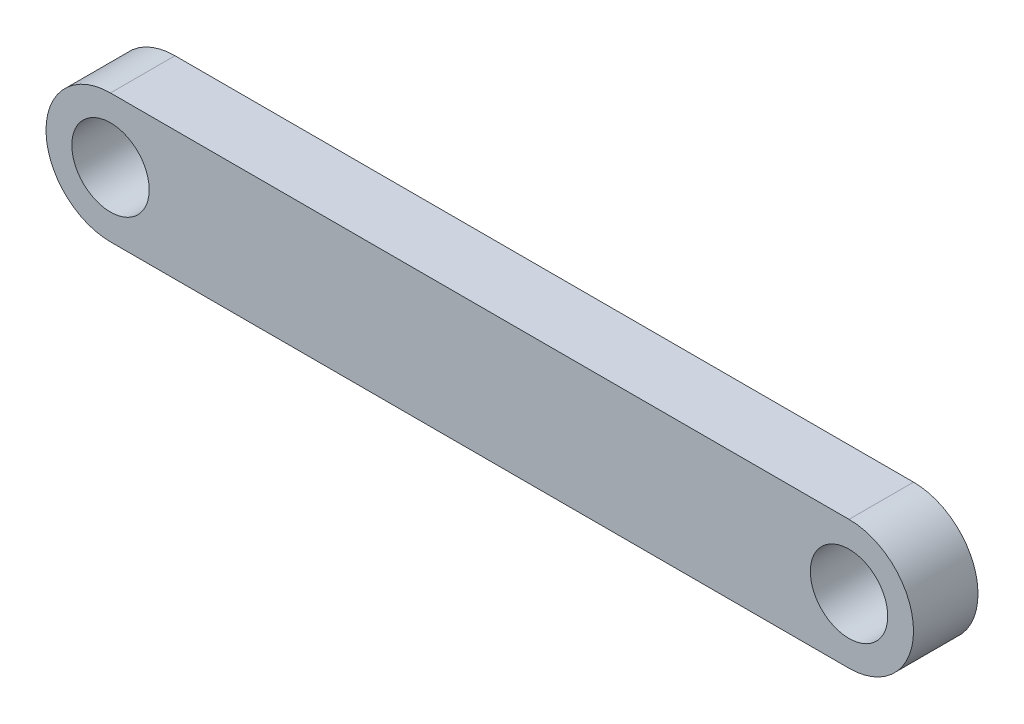
ISO-10303-21;
HEADER;
FILE_DESCRIPTION(('STEP AP214'),'2;1');
FILE_NAME('part.step','',(''),(''),'','','');
FILE_SCHEMA(('AUTOMOTIVE_DESIGN { 1 0 10303 214 1 1 1 1 }'));
ENDSEC;
DATA;
#1=APPLICATION_CONTEXT('core data for automotive mechanical design processes');
#2=APPLICATION_PROTOCOL_DEFINITION('international standard','automotive_design',2000,#1);
#3=PRODUCT_CONTEXT('',#1,'mechanical');
#4=PRODUCT('Part','Part','',(#3));
#5=PRODUCT_RELATED_PRODUCT_CATEGORY('part','',(#4));
#6=PRODUCT_DEFINITION_FORMATION('','',#4);
#7=PRODUCT_DEFINITION_CONTEXT('part definition',#1,'design');
#8=PRODUCT_DEFINITION('design','',#6,#7);
#9=PRODUCT_DEFINITION_SHAPE('','',#8);
#10=(LENGTH_UNIT() NAMED_UNIT(*) SI_UNIT(.MILLI.,.METRE.));
#11=(NAMED_UNIT(*) PLANE_ANGLE_UNIT() SI_UNIT($,.RADIAN.));
#12=(NAMED_UNIT(*) SI_UNIT($,.STERADIAN.) SOLID_ANGLE_UNIT());
#13=UNCERTAINTY_MEASURE_WITH_UNIT(LENGTH_MEASURE(1.E-05),#10,'distance_accuracy_value','');
#14=(GEOMETRIC_REPRESENTATION_CONTEXT(3) GLOBAL_UNCERTAINTY_ASSIGNED_CONTEXT((#13)) GLOBAL_UNIT_ASSIGNED_CONTEXT((#10,
#11,#12)) REPRESENTATION_CONTEXT('',''));
#15=CARTESIAN_POINT('',(0.,0.,0.));
#16=DIRECTION('',(0.,0.,1.));
#17=DIRECTION('',(1.,0.,0.));
#18=AXIS2_PLACEMENT_3D('',#15,#16,#17);
#19=CARTESIAN_POINT('',(0.,0.,50.));
#20=DIRECTION('',(0.,0.,1.));
#21=DIRECTION('',(1.,0.,0.));
#22=AXIS2_PLACEMENT_3D('',#19,#20,#21);
#23=PLANE('',#22);
#24=CARTESIAN_POINT('',(0.,0.,50.));
#25=DIRECTION('',(0.,0.,1.));
#26=DIRECTION('',(1.,0.,0.));
#27=AXIS2_PLACEMENT_3D('',#24,#25,#26);
#28=CIRCLE('',#27,30.);
#29=CARTESIAN_POINT('',(30.,0.,50.));
#30=VERTEX_POINT('',#29);
#31=EDGE_CURVE('E118',#30,#30,#28,.T.);
#32=ORIENTED_EDGE('',*,*,#31,.F.);
#33=EDGE_LOOP('',(#32));
#34=FACE_BOUND('',#33,.T.);
#35=CARTESIAN_POINT('',(0.,0.,50.));
#36=DIRECTION('',(0.,0.,1.));
#37=DIRECTION('',(1.,0.,0.));
#38=AXIS2_PLACEMENT_3D('',#35,#36,#37);
#39=CIRCLE('',#38,50.);
#40=CARTESIAN_POINT('',(0.,50.,50.));
#41=VERTEX_POINT('',#40);
#42=CARTESIAN_POINT('',(0.,-50.,50.));
#43=VERTEX_POINT('',#42);
#44=EDGE_CURVE('E98',#41,#43,#39,.T.);
#45=ORIENTED_EDGE('',*,*,#44,.T.);
#46=DIRECTION('',(1.,0.,0.));
#47=VECTOR('',#46,1.);
#48=CARTESIAN_POINT('',(0.,-50.,50.));
#49=LINE('',#48,#47);
#50=CARTESIAN_POINT('',(572.6,-50.,50.));
#51=VERTEX_POINT('',#50);
#52=EDGE_CURVE('E93',#43,#51,#49,.T.);
#53=ORIENTED_EDGE('',*,*,#52,.T.);
#54=CARTESIAN_POINT('',(572.6,0.,50.));
#55=DIRECTION('',(0.,0.,1.));
#56=DIRECTION('',(1.,0.,0.));
#57=AXIS2_PLACEMENT_3D('',#54,#55,#56);
#58=CIRCLE('',#57,50.);
#59=CARTESIAN_POINT('',(572.6,50.,50.));
#60=VERTEX_POINT('',#59);
#61=EDGE_CURVE('E96',#51,#60,#58,.T.);
#62=ORIENTED_EDGE('',*,*,#61,.T.);
#63=DIRECTION('',(-1.,0.,0.));
#64=VECTOR('',#63,1.);
#65=CARTESIAN_POINT('',(0.,50.,50.));
#66=LINE('',#65,#64);
#67=EDGE_CURVE('E63',#60,#41,#66,.T.);
#68=ORIENTED_EDGE('',*,*,#67,.T.);
#69=EDGE_LOOP('',(#45,#53,#62,#68));
#70=FACE_BOUND('',#69,.T.);
#71=CARTESIAN_POINT('',(572.6,0.,50.));
#72=DIRECTION('',(0.,0.,1.));
#73=DIRECTION('',(1.,0.,0.));
#74=AXIS2_PLACEMENT_3D('',#71,#72,#73);
#75=CIRCLE('',#74,30.);
#76=CARTESIAN_POINT('',(602.6,0.,50.));
#77=VERTEX_POINT('',#76);
#78=EDGE_CURVE('E140',#77,#77,#75,.T.);
#79=ORIENTED_EDGE('',*,*,#78,.F.);
#80=EDGE_LOOP('',(#79));
#81=FACE_BOUND('',#80,.T.);
#82=ADVANCED_FACE('F45',(#34,#70,#81),#23,.T.);
#83=CARTESIAN_POINT('',(0.,0.,0.));
#84=DIRECTION('',(0.,0.,1.));
#85=DIRECTION('',(1.,0.,0.));
#86=AXIS2_PLACEMENT_3D('',#83,#84,#85);
#87=PLANE('',#86);
#88=CARTESIAN_POINT('',(0.,0.,0.));
#89=DIRECTION('',(0.,0.,1.));
#90=DIRECTION('',(1.,0.,0.));
#91=AXIS2_PLACEMENT_3D('',#88,#89,#90);
#92=CIRCLE('',#91,50.);
#93=CARTESIAN_POINT('',(0.,50.,0.));
#94=VERTEX_POINT('',#93);
#95=CARTESIAN_POINT('',(0.,-50.,0.));
#96=VERTEX_POINT('',#95);
#97=EDGE_CURVE('E114',#94,#96,#92,.T.);
#98=ORIENTED_EDGE('',*,*,#97,.F.);
#99=DIRECTION('',(-1.,0.,0.));
#100=VECTOR('',#99,1.);
#101=CARTESIAN_POINT('',(0.,50.,0.));
#102=LINE('',#101,#100);
#103=CARTESIAN_POINT('',(572.6,50.,0.));
#104=VERTEX_POINT('',#103);
#105=EDGE_CURVE('E86',#104,#94,#102,.T.);
#106=ORIENTED_EDGE('',*,*,#105,.F.);
#107=CARTESIAN_POINT('',(572.6,0.,0.));
#108=DIRECTION('',(0.,0.,1.));
#109=DIRECTION('',(1.,0.,0.));
#110=AXIS2_PLACEMENT_3D('',#107,#108,#109);
#111=CIRCLE('',#110,50.);
#112=CARTESIAN_POINT('',(572.6,-50.,0.));
#113=VERTEX_POINT('',#112);
#114=EDGE_CURVE('E80',#113,#104,#111,.T.);
#115=ORIENTED_EDGE('',*,*,#114,.F.);
#116=DIRECTION('',(1.,0.,0.));
#117=VECTOR('',#116,1.);
#118=CARTESIAN_POINT('',(0.,-50.,0.));
#119=LINE('',#118,#117);
#120=EDGE_CURVE('E103',#96,#113,#119,.T.);
#121=ORIENTED_EDGE('',*,*,#120,.F.);
#122=EDGE_LOOP('',(#98,#106,#115,#121));
#123=FACE_BOUND('',#122,.T.);
#124=CARTESIAN_POINT('',(0.,0.,0.));
#125=DIRECTION('',(0.,0.,1.));
#126=DIRECTION('',(1.,0.,0.));
#127=AXIS2_PLACEMENT_3D('',#124,#125,#126);
#128=CIRCLE('',#127,30.);
#129=CARTESIAN_POINT('',(30.,0.,0.));
#130=VERTEX_POINT('',#129);
#131=EDGE_CURVE('E136',#130,#130,#128,.T.);
#132=ORIENTED_EDGE('',*,*,#131,.T.);
#133=EDGE_LOOP('',(#132));
#134=FACE_BOUND('',#133,.T.);
#135=CARTESIAN_POINT('',(572.6,0.,0.));
#136=DIRECTION('',(0.,0.,1.));
#137=DIRECTION('',(1.,0.,0.));
#138=AXIS2_PLACEMENT_3D('',#135,#136,#137);
#139=CIRCLE('',#138,30.);
#140=CARTESIAN_POINT('',(602.6,0.,0.));
#141=VERTEX_POINT('',#140);
#142=EDGE_CURVE('E144',#141,#141,#139,.T.);
#143=ORIENTED_EDGE('',*,*,#142,.T.);
#144=EDGE_LOOP('',(#143));
#145=FACE_BOUND('',#144,.T.);
#146=ADVANCED_FACE('F131',(#123,#134,#145),#87,.F.);
#147=CARTESIAN_POINT('',(0.,0.,50.));
#148=DIRECTION('',(0.,0.,-1.));
#149=DIRECTION('',(-1.,0.,0.));
#150=AXIS2_PLACEMENT_3D('',#147,#148,#149);
#151=CYLINDRICAL_SURFACE('',#150,50.);
#152=ORIENTED_EDGE('',*,*,#97,.T.);
#153=DIRECTION('',(0.,0.,-1.));
#154=VECTOR('',#153,1.);
#155=CARTESIAN_POINT('',(0.,-50.,50.));
#156=LINE('',#155,#154);
#157=EDGE_CURVE('E11',#43,#96,#156,.T.);
#158=ORIENTED_EDGE('',*,*,#157,.F.);
#159=ORIENTED_EDGE('',*,*,#44,.F.);
#160=DIRECTION('',(0.,0.,-1.));
#161=VECTOR('',#160,1.);
#162=CARTESIAN_POINT('',(0.,50.,50.));
#163=LINE('',#162,#161);
#164=EDGE_CURVE('E110',#41,#94,#163,.T.);
#165=ORIENTED_EDGE('',*,*,#164,.T.);
#166=EDGE_LOOP('',(#152,#158,#159,#165));
#167=FACE_BOUND('',#166,.T.);
#168=ADVANCED_FACE('F47',(#167),#151,.T.);
#169=CARTESIAN_POINT('',(0.,-50.,50.));
#170=DIRECTION('',(0.,1.,0.));
#171=DIRECTION('',(-1.,0.,0.));
#172=AXIS2_PLACEMENT_3D('',#169,#170,#171);
#173=PLANE('',#172);
#174=ORIENTED_EDGE('',*,*,#120,.T.);
#175=DIRECTION('',(0.,0.,-1.));
#176=VECTOR('',#175,1.);
#177=CARTESIAN_POINT('',(572.6,-50.,50.));
#178=LINE('',#177,#176);
#179=EDGE_CURVE('E55',#51,#113,#178,.T.);
#180=ORIENTED_EDGE('',*,*,#179,.F.);
#181=ORIENTED_EDGE('',*,*,#52,.F.);
#182=ORIENTED_EDGE('',*,*,#157,.T.);
#183=EDGE_LOOP('',(#174,#180,#181,#182));
#184=FACE_BOUND('',#183,.T.);
#185=ADVANCED_FACE('F102',(#184),#173,.F.);
#186=CARTESIAN_POINT('',(572.6,0.,50.));
#187=DIRECTION('',(0.,0.,-1.));
#188=DIRECTION('',(-1.,0.,0.));
#189=AXIS2_PLACEMENT_3D('',#186,#187,#188);
#190=CYLINDRICAL_SURFACE('',#189,50.);
#191=ORIENTED_EDGE('',*,*,#114,.T.);
#192=DIRECTION('',(0.,0.,-1.));
#193=VECTOR('',#192,1.);
#194=CARTESIAN_POINT('',(572.6,50.,50.));
#195=LINE('',#194,#193);
#196=EDGE_CURVE('E105',#60,#104,#195,.T.);
#197=ORIENTED_EDGE('',*,*,#196,.F.);
#198=ORIENTED_EDGE('',*,*,#61,.F.);
#199=ORIENTED_EDGE('',*,*,#179,.T.);
#200=EDGE_LOOP('',(#191,#197,#198,#199));
#201=FACE_BOUND('',#200,.T.);
#202=ADVANCED_FACE('F106',(#201),#190,.T.);
#203=CARTESIAN_POINT('',(0.,50.,50.));
#204=DIRECTION('',(0.,-1.,0.));
#205=DIRECTION('',(1.,0.,0.));
#206=AXIS2_PLACEMENT_3D('',#203,#204,#205);
#207=PLANE('',#206);
#208=ORIENTED_EDGE('',*,*,#105,.T.);
#209=ORIENTED_EDGE('',*,*,#164,.F.);
#210=ORIENTED_EDGE('',*,*,#67,.F.);
#211=ORIENTED_EDGE('',*,*,#196,.T.);
#212=EDGE_LOOP('',(#208,#209,#210,#211));
#213=FACE_BOUND('',#212,.T.);
#214=ADVANCED_FACE('F128',(#213),#207,.F.);
#215=CARTESIAN_POINT('',(0.,0.,50.));
#216=DIRECTION('',(0.,0.,-1.));
#217=DIRECTION('',(-1.,0.,0.));
#218=AXIS2_PLACEMENT_3D('',#215,#216,#217);
#219=CYLINDRICAL_SURFACE('',#218,30.);
#220=ORIENTED_EDGE('',*,*,#31,.T.);
#221=EDGE_LOOP('',(#220));
#222=FACE_BOUND('',#221,.T.);
#223=ORIENTED_EDGE('',*,*,#131,.F.);
#224=EDGE_LOOP('',(#223));
#225=FACE_BOUND('',#224,.T.);
#226=ADVANCED_FACE('F163',(#222,#225),#219,.F.);
#227=CARTESIAN_POINT('',(572.6,0.,50.));
#228=DIRECTION('',(0.,0.,-1.));
#229=DIRECTION('',(-1.,0.,0.));
#230=AXIS2_PLACEMENT_3D('',#227,#228,#229);
#231=CYLINDRICAL_SURFACE('',#230,30.);
#232=ORIENTED_EDGE('',*,*,#78,.T.);
#233=EDGE_LOOP('',(#232));
#234=FACE_BOUND('',#233,.T.);
#235=ORIENTED_EDGE('',*,*,#142,.F.);
#236=EDGE_LOOP('',(#235));
#237=FACE_BOUND('',#236,.T.);
#238=ADVANCED_FACE('F152',(#234,#237),#231,.F.);
#239=CLOSED_SHELL('',(#82,#146,#168,#185,#202,#214,#226,#238));
#240=MANIFOLD_SOLID_BREP('B2',#239);
#241=ADVANCED_BREP_SHAPE_REPRESENTATION('',(#18,#240),#14);
#242=SHAPE_DEFINITION_REPRESENTATION(#9,#241);
ENDSEC;
END-ISO-10303-21;
